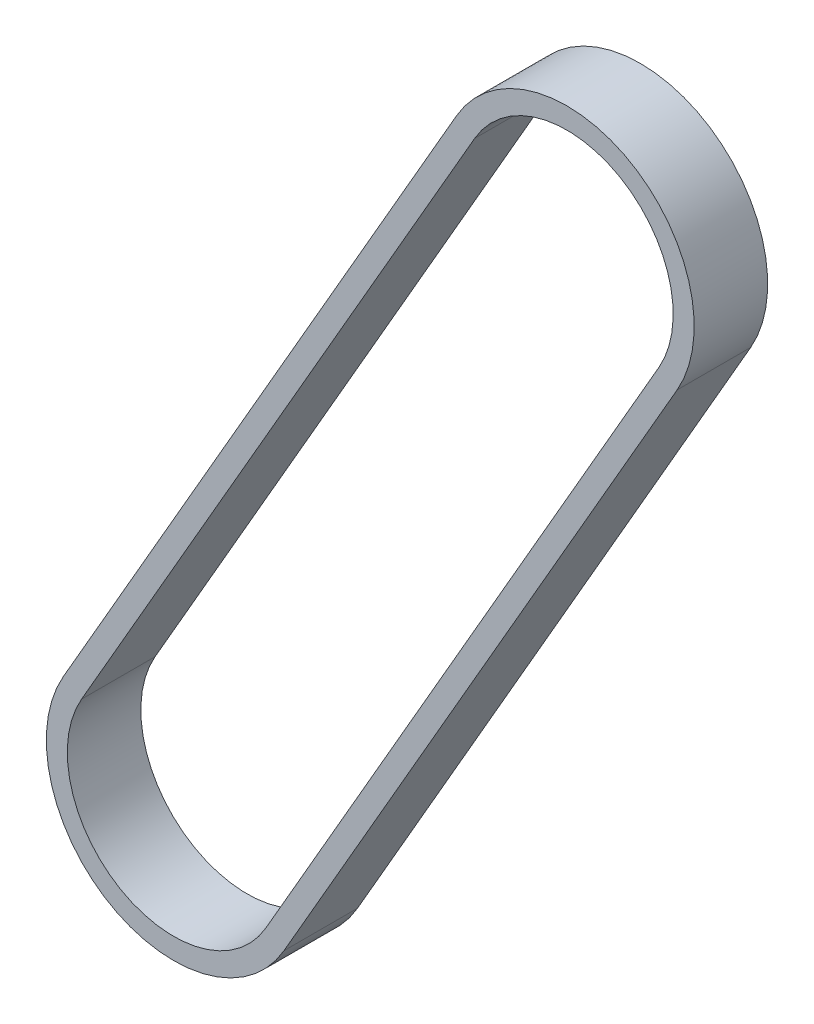
ISO-10303-21;
HEADER;
FILE_DESCRIPTION(('STEP AP214'),'2;1');
FILE_NAME('part.step','',(''),(''),'','','');
FILE_SCHEMA(('AUTOMOTIVE_DESIGN { 1 0 10303 214 1 1 1 1 }'));
ENDSEC;
DATA;
#1=APPLICATION_CONTEXT('core data for automotive mechanical design processes');
#2=APPLICATION_PROTOCOL_DEFINITION('international standard','automotive_design',2000,#1);
#3=PRODUCT_CONTEXT('',#1,'mechanical');
#4=PRODUCT('Part','Part','',(#3));
#5=PRODUCT_RELATED_PRODUCT_CATEGORY('part','',(#4));
#6=PRODUCT_DEFINITION_FORMATION('','',#4);
#7=PRODUCT_DEFINITION_CONTEXT('part definition',#1,'design');
#8=PRODUCT_DEFINITION('design','',#6,#7);
#9=PRODUCT_DEFINITION_SHAPE('','',#8);
#10=(LENGTH_UNIT() NAMED_UNIT(*) SI_UNIT(.MILLI.,.METRE.));
#11=(NAMED_UNIT(*) PLANE_ANGLE_UNIT() SI_UNIT($,.RADIAN.));
#12=(NAMED_UNIT(*) SI_UNIT($,.STERADIAN.) SOLID_ANGLE_UNIT());
#13=UNCERTAINTY_MEASURE_WITH_UNIT(LENGTH_MEASURE(1.E-05),#10,'distance_accuracy_value','');
#14=(GEOMETRIC_REPRESENTATION_CONTEXT(3) GLOBAL_UNCERTAINTY_ASSIGNED_CONTEXT((#13)) GLOBAL_UNIT_ASSIGNED_CONTEXT((#10,
#11,#12)) REPRESENTATION_CONTEXT('',''));
#15=CARTESIAN_POINT('',(0.,0.,0.));
#16=DIRECTION('',(0.,0.,1.));
#17=DIRECTION('',(1.,0.,0.));
#18=AXIS2_PLACEMENT_3D('',#15,#16,#17);
#19=CARTESIAN_POINT('',(-27.0067414246904,31.998578186546,3.5));
#20=DIRECTION('',(0.,0.,-1.));
#21=DIRECTION('',(-1.,0.,0.));
#22=AXIS2_PLACEMENT_3D('',#19,#20,#21);
#23=PLANE('',#22);
#24=CARTESIAN_POINT('',(-27.0067414246904,31.998578186546,3.5));
#25=DIRECTION('',(0.,0.,-1.));
#26=DIRECTION('',(-1.,0.,0.));
#27=AXIS2_PLACEMENT_3D('',#24,#25,#26);
#28=CIRCLE('',#27,12.125);
#29=CARTESIAN_POINT('',(-16.5014356972318,25.9443089017663,3.5));
#30=VERTEX_POINT('',#29);
#31=CARTESIAN_POINT('',(-37.5120471521489,38.0528474713257,3.5));
#32=VERTEX_POINT('',#31);
#33=EDGE_CURVE('E160',#30,#32,#28,.F.);
#34=ORIENTED_EDGE('',*,*,#33,.T.);
#35=DIRECTION('',(-0.499321178126161,-0.866416967213075,0.));
#36=VECTOR('',#35,1.);
#37=CARTESIAN_POINT('',(-37.5120471521489,38.0528474713257,3.5));
#38=LINE('',#37,#36);
#39=CARTESIAN_POINT('',(-74.961135511611,-26.928425069655,3.5));
#40=VERTEX_POINT('',#39);
#41=EDGE_CURVE('E163',#32,#40,#38,.T.);
#42=ORIENTED_EDGE('',*,*,#41,.T.);
#43=CARTESIAN_POINT('',(-64.4558297841525,-32.9826943544347,3.5));
#44=DIRECTION('',(0.,0.,-1.));
#45=DIRECTION('',(-1.,0.,0.));
#46=AXIS2_PLACEMENT_3D('',#43,#44,#45);
#47=CIRCLE('',#46,12.125);
#48=CARTESIAN_POINT('',(-53.9505240566939,-39.0369636392144,3.5));
#49=VERTEX_POINT('',#48);
#50=EDGE_CURVE('E166',#40,#49,#47,.F.);
#51=ORIENTED_EDGE('',*,*,#50,.T.);
#52=DIRECTION('',(0.499321178126161,0.866416967213075,0.));
#53=VECTOR('',#52,1.);
#54=CARTESIAN_POINT('',(-16.5014356972318,25.9443089017663,3.5));
#55=LINE('',#54,#53);
#56=EDGE_CURVE('E168',#49,#30,#55,.T.);
#57=ORIENTED_EDGE('',*,*,#56,.T.);
#58=EDGE_LOOP('',(#34,#42,#51,#57));
#59=FACE_BOUND('',#58,.T.);
#60=CARTESIAN_POINT('',(-27.0067414246904,31.998578186546,3.5));
#61=DIRECTION('',(0.,0.,1.));
#62=DIRECTION('',(-1.,0.,0.));
#63=AXIS2_PLACEMENT_3D('',#60,#61,#62);
#64=CIRCLE('',#63,10.125);
#65=CARTESIAN_POINT('',(-18.234269631658,26.9429512580186,3.5));
#66=VERTEX_POINT('',#65);
#67=CARTESIAN_POINT('',(-35.7792132177228,37.0542051150734,3.5));
#68=VERTEX_POINT('',#67);
#69=EDGE_CURVE('E124',#66,#68,#64,.T.);
#70=ORIENTED_EDGE('',*,*,#69,.F.);
#71=DIRECTION('',(0.499321178126161,0.866416967213075,0.));
#72=VECTOR('',#71,1.);
#73=CARTESIAN_POINT('',(-18.234269631658,26.9429512580186,3.5));
#74=LINE('',#73,#72);
#75=CARTESIAN_POINT('',(-55.6833579911201,-38.038321282962,3.5));
#76=VERTEX_POINT('',#75);
#77=EDGE_CURVE('E146',#76,#66,#74,.T.);
#78=ORIENTED_EDGE('',*,*,#77,.F.);
#79=CARTESIAN_POINT('',(-64.4558297841525,-32.9826943544347,3.5));
#80=DIRECTION('',(0.,0.,1.));
#81=DIRECTION('',(-1.,0.,0.));
#82=AXIS2_PLACEMENT_3D('',#79,#80,#81);
#83=CIRCLE('',#82,10.125);
#84=CARTESIAN_POINT('',(-73.2283015771848,-27.9270674259073,3.5));
#85=VERTEX_POINT('',#84);
#86=EDGE_CURVE('E144',#85,#76,#83,.T.);
#87=ORIENTED_EDGE('',*,*,#86,.F.);
#88=DIRECTION('',(-0.499321178126161,-0.866416967213075,0.));
#89=VECTOR('',#88,1.);
#90=CARTESIAN_POINT('',(-73.2283015771848,-27.9270674259073,3.5));
#91=LINE('',#90,#89);
#92=EDGE_CURVE('E132',#68,#85,#91,.T.);
#93=ORIENTED_EDGE('',*,*,#92,.F.);
#94=EDGE_LOOP('',(#70,#78,#87,#93));
#95=FACE_BOUND('',#94,.T.);
#96=ADVANCED_FACE('F59',(#59,#95),#23,.F.);
#97=CARTESIAN_POINT('',(-27.0067414246904,31.998578186546,-3.5));
#98=DIRECTION('',(0.,0.,-1.));
#99=DIRECTION('',(-1.,0.,0.));
#100=AXIS2_PLACEMENT_3D('',#97,#98,#99);
#101=PLANE('',#100);
#102=CARTESIAN_POINT('',(-27.0067414246904,31.998578186546,-3.5));
#103=DIRECTION('',(0.,0.,-1.));
#104=DIRECTION('',(-1.,0.,0.));
#105=AXIS2_PLACEMENT_3D('',#102,#103,#104);
#106=CIRCLE('',#105,12.125);
#107=CARTESIAN_POINT('',(-16.5014356972318,25.9443089017663,-3.5));
#108=VERTEX_POINT('',#107);
#109=CARTESIAN_POINT('',(-37.5120471521489,38.0528474713257,-3.5));
#110=VERTEX_POINT('',#109);
#111=EDGE_CURVE('E140',#108,#110,#106,.F.);
#112=ORIENTED_EDGE('',*,*,#111,.F.);
#113=DIRECTION('',(0.499321178126161,0.866416967213075,0.));
#114=VECTOR('',#113,1.);
#115=CARTESIAN_POINT('',(-16.5014356972318,25.9443089017663,-3.5));
#116=LINE('',#115,#114);
#117=CARTESIAN_POINT('',(-53.9505240566939,-39.0369636392144,-3.5));
#118=VERTEX_POINT('',#117);
#119=EDGE_CURVE('E164',#118,#108,#116,.T.);
#120=ORIENTED_EDGE('',*,*,#119,.F.);
#121=CARTESIAN_POINT('',(-64.4558297841525,-32.9826943544347,-3.5));
#122=DIRECTION('',(0.,0.,-1.));
#123=DIRECTION('',(-1.,0.,0.));
#124=AXIS2_PLACEMENT_3D('',#121,#122,#123);
#125=CIRCLE('',#124,12.125);
#126=CARTESIAN_POINT('',(-74.961135511611,-26.928425069655,-3.5));
#127=VERTEX_POINT('',#126);
#128=EDGE_CURVE('E175',#127,#118,#125,.F.);
#129=ORIENTED_EDGE('',*,*,#128,.F.);
#130=DIRECTION('',(-0.499321178126161,-0.866416967213075,0.));
#131=VECTOR('',#130,1.);
#132=CARTESIAN_POINT('',(-37.5120471521489,38.0528474713257,-3.5));
#133=LINE('',#132,#131);
#134=EDGE_CURVE('E173',#110,#127,#133,.T.);
#135=ORIENTED_EDGE('',*,*,#134,.F.);
#136=EDGE_LOOP('',(#112,#120,#129,#135));
#137=FACE_BOUND('',#136,.T.);
#138=DIRECTION('',(0.499321178126161,0.866416967213075,0.));
#139=VECTOR('',#138,1.);
#140=CARTESIAN_POINT('',(-18.234269631658,26.9429512580186,-3.5));
#141=LINE('',#140,#139);
#142=CARTESIAN_POINT('',(-55.6833579911201,-38.038321282962,-3.5));
#143=VERTEX_POINT('',#142);
#144=CARTESIAN_POINT('',(-18.234269631658,26.9429512580186,-3.5));
#145=VERTEX_POINT('',#144);
#146=EDGE_CURVE('E133',#143,#145,#141,.T.);
#147=ORIENTED_EDGE('',*,*,#146,.T.);
#148=CARTESIAN_POINT('',(-27.0067414246904,31.998578186546,-3.5));
#149=DIRECTION('',(0.,0.,1.));
#150=DIRECTION('',(-1.,0.,0.));
#151=AXIS2_PLACEMENT_3D('',#148,#149,#150);
#152=CIRCLE('',#151,10.125);
#153=CARTESIAN_POINT('',(-35.7792132177228,37.0542051150734,-3.5));
#154=VERTEX_POINT('',#153);
#155=EDGE_CURVE('E82',#145,#154,#152,.T.);
#156=ORIENTED_EDGE('',*,*,#155,.T.);
#157=DIRECTION('',(-0.499321178126161,-0.866416967213075,0.));
#158=VECTOR('',#157,1.);
#159=CARTESIAN_POINT('',(-73.2283015771848,-27.9270674259073,-3.5));
#160=LINE('',#159,#158);
#161=CARTESIAN_POINT('',(-73.2283015771848,-27.9270674259073,-3.5));
#162=VERTEX_POINT('',#161);
#163=EDGE_CURVE('E139',#154,#162,#160,.T.);
#164=ORIENTED_EDGE('',*,*,#163,.T.);
#165=CARTESIAN_POINT('',(-64.4558297841525,-32.9826943544347,-3.5));
#166=DIRECTION('',(0.,0.,1.));
#167=DIRECTION('',(-1.,0.,0.));
#168=AXIS2_PLACEMENT_3D('',#165,#166,#167);
#169=CIRCLE('',#168,10.125);
#170=EDGE_CURVE('E152',#162,#143,#169,.T.);
#171=ORIENTED_EDGE('',*,*,#170,.T.);
#172=EDGE_LOOP('',(#147,#156,#164,#171));
#173=FACE_BOUND('',#172,.T.);
#174=ADVANCED_FACE('F193',(#137,#173),#101,.T.);
#175=CARTESIAN_POINT('',(-27.0067414246904,31.998578186546,3.5));
#176=DIRECTION('',(0.,0.,-1.));
#177=DIRECTION('',(-1.,0.,0.));
#178=AXIS2_PLACEMENT_3D('',#175,#176,#177);
#179=CYLINDRICAL_SURFACE('',#178,12.125);
#180=ORIENTED_EDGE('',*,*,#111,.T.);
#181=DIRECTION('',(0.,0.,-1.));
#182=VECTOR('',#181,1.);
#183=CARTESIAN_POINT('',(-37.5120471521489,38.0528474713257,3.5));
#184=LINE('',#183,#182);
#185=EDGE_CURVE('E12',#32,#110,#184,.T.);
#186=ORIENTED_EDGE('',*,*,#185,.F.);
#187=ORIENTED_EDGE('',*,*,#33,.F.);
#188=DIRECTION('',(0.,0.,-1.));
#189=VECTOR('',#188,1.);
#190=CARTESIAN_POINT('',(-16.5014356972318,25.9443089017663,3.5));
#191=LINE('',#190,#189);
#192=EDGE_CURVE('E170',#30,#108,#191,.T.);
#193=ORIENTED_EDGE('',*,*,#192,.T.);
#194=EDGE_LOOP('',(#180,#186,#187,#193));
#195=FACE_BOUND('',#194,.T.);
#196=ADVANCED_FACE('F61',(#195),#179,.T.);
#197=CARTESIAN_POINT('',(-37.5120471521489,38.0528474713257,3.5));
#198=DIRECTION('',(0.866416967213075,-0.499321178126161,0.));
#199=DIRECTION('',(0.499321178126161,0.866416967213075,0.));
#200=AXIS2_PLACEMENT_3D('',#197,#198,#199);
#201=PLANE('',#200);
#202=ORIENTED_EDGE('',*,*,#134,.T.);
#203=DIRECTION('',(0.,0.,-1.));
#204=VECTOR('',#203,1.);
#205=CARTESIAN_POINT('',(-74.961135511611,-26.928425069655,3.5));
#206=LINE('',#205,#204);
#207=EDGE_CURVE('E67',#40,#127,#206,.T.);
#208=ORIENTED_EDGE('',*,*,#207,.F.);
#209=ORIENTED_EDGE('',*,*,#41,.F.);
#210=ORIENTED_EDGE('',*,*,#185,.T.);
#211=EDGE_LOOP('',(#202,#208,#209,#210));
#212=FACE_BOUND('',#211,.T.);
#213=ADVANCED_FACE('F203',(#212),#201,.F.);
#214=CARTESIAN_POINT('',(-64.4558297841525,-32.9826943544347,3.5));
#215=DIRECTION('',(0.,0.,-1.));
#216=DIRECTION('',(-1.,0.,0.));
#217=AXIS2_PLACEMENT_3D('',#214,#215,#216);
#218=CYLINDRICAL_SURFACE('',#217,12.125);
#219=ORIENTED_EDGE('',*,*,#128,.T.);
#220=DIRECTION('',(0.,0.,-1.));
#221=VECTOR('',#220,1.);
#222=CARTESIAN_POINT('',(-53.9505240566939,-39.0369636392144,3.5));
#223=LINE('',#222,#221);
#224=EDGE_CURVE('E180',#49,#118,#223,.T.);
#225=ORIENTED_EDGE('',*,*,#224,.F.);
#226=ORIENTED_EDGE('',*,*,#50,.F.);
#227=ORIENTED_EDGE('',*,*,#207,.T.);
#228=EDGE_LOOP('',(#219,#225,#226,#227));
#229=FACE_BOUND('',#228,.T.);
#230=ADVANCED_FACE('F187',(#229),#218,.T.);
#231=CARTESIAN_POINT('',(-16.5014356972318,25.9443089017663,3.5));
#232=DIRECTION('',(-0.866416967213075,0.499321178126161,0.));
#233=DIRECTION('',(-0.499321178126161,-0.866416967213075,0.));
#234=AXIS2_PLACEMENT_3D('',#231,#232,#233);
#235=PLANE('',#234);
#236=ORIENTED_EDGE('',*,*,#119,.T.);
#237=ORIENTED_EDGE('',*,*,#192,.F.);
#238=ORIENTED_EDGE('',*,*,#56,.F.);
#239=ORIENTED_EDGE('',*,*,#224,.T.);
#240=EDGE_LOOP('',(#236,#237,#238,#239));
#241=FACE_BOUND('',#240,.T.);
#242=ADVANCED_FACE('F197',(#241),#235,.F.);
#243=CARTESIAN_POINT('',(-27.0067414246904,31.998578186546,3.5));
#244=DIRECTION('',(0.,0.,-1.));
#245=DIRECTION('',(-1.,0.,0.));
#246=AXIS2_PLACEMENT_3D('',#243,#244,#245);
#247=CYLINDRICAL_SURFACE('',#246,10.125);
#248=ORIENTED_EDGE('',*,*,#155,.F.);
#249=DIRECTION('',(0.,0.,-1.));
#250=VECTOR('',#249,1.);
#251=CARTESIAN_POINT('',(-18.234269631658,26.9429512580186,3.5));
#252=LINE('',#251,#250);
#253=EDGE_CURVE('E128',#66,#145,#252,.T.);
#254=ORIENTED_EDGE('',*,*,#253,.F.);
#255=ORIENTED_EDGE('',*,*,#69,.T.);
#256=DIRECTION('',(0.,0.,-1.));
#257=VECTOR('',#256,1.);
#258=CARTESIAN_POINT('',(-35.7792132177228,37.0542051150734,3.5));
#259=LINE('',#258,#257);
#260=EDGE_CURVE('E127',#68,#154,#259,.T.);
#261=ORIENTED_EDGE('',*,*,#260,.T.);
#262=EDGE_LOOP('',(#248,#254,#255,#261));
#263=FACE_BOUND('',#262,.T.);
#264=ADVANCED_FACE('F126',(#263),#247,.F.);
#265=CARTESIAN_POINT('',(-73.2283015771848,-27.9270674259073,3.5));
#266=DIRECTION('',(0.866416967213075,-0.499321178126161,0.));
#267=DIRECTION('',(0.499321178126161,0.866416967213075,0.));
#268=AXIS2_PLACEMENT_3D('',#265,#266,#267);
#269=PLANE('',#268);
#270=ORIENTED_EDGE('',*,*,#163,.F.);
#271=ORIENTED_EDGE('',*,*,#260,.F.);
#272=ORIENTED_EDGE('',*,*,#92,.T.);
#273=DIRECTION('',(0.,0.,-1.));
#274=VECTOR('',#273,1.);
#275=CARTESIAN_POINT('',(-73.2283015771848,-27.9270674259073,3.5));
#276=LINE('',#275,#274);
#277=EDGE_CURVE('E141',#85,#162,#276,.T.);
#278=ORIENTED_EDGE('',*,*,#277,.T.);
#279=EDGE_LOOP('',(#270,#271,#272,#278));
#280=FACE_BOUND('',#279,.T.);
#281=ADVANCED_FACE('F136',(#280),#269,.T.);
#282=CARTESIAN_POINT('',(-64.4558297841525,-32.9826943544347,3.5));
#283=DIRECTION('',(0.,0.,-1.));
#284=DIRECTION('',(-1.,0.,0.));
#285=AXIS2_PLACEMENT_3D('',#282,#283,#284);
#286=CYLINDRICAL_SURFACE('',#285,10.125);
#287=ORIENTED_EDGE('',*,*,#170,.F.);
#288=ORIENTED_EDGE('',*,*,#277,.F.);
#289=ORIENTED_EDGE('',*,*,#86,.T.);
#290=DIRECTION('',(0.,0.,-1.));
#291=VECTOR('',#290,1.);
#292=CARTESIAN_POINT('',(-55.6833579911201,-38.038321282962,3.5));
#293=LINE('',#292,#291);
#294=EDGE_CURVE('E74',#76,#143,#293,.T.);
#295=ORIENTED_EDGE('',*,*,#294,.T.);
#296=EDGE_LOOP('',(#287,#288,#289,#295));
#297=FACE_BOUND('',#296,.T.);
#298=ADVANCED_FACE('F226',(#297),#286,.F.);
#299=CARTESIAN_POINT('',(-18.234269631658,26.9429512580186,3.5));
#300=DIRECTION('',(-0.866416967213075,0.499321178126161,0.));
#301=DIRECTION('',(-0.499321178126161,-0.866416967213075,0.));
#302=AXIS2_PLACEMENT_3D('',#299,#300,#301);
#303=PLANE('',#302);
#304=ORIENTED_EDGE('',*,*,#146,.F.);
#305=ORIENTED_EDGE('',*,*,#294,.F.);
#306=ORIENTED_EDGE('',*,*,#77,.T.);
#307=ORIENTED_EDGE('',*,*,#253,.T.);
#308=EDGE_LOOP('',(#304,#305,#306,#307));
#309=FACE_BOUND('',#308,.T.);
#310=ADVANCED_FACE('F230',(#309),#303,.T.);
#311=CLOSED_SHELL('',(#96,#174,#196,#213,#230,#242,#264,#281,#298,#310));
#312=MANIFOLD_SOLID_BREP('B2',#311);
#313=ADVANCED_BREP_SHAPE_REPRESENTATION('',(#18,#312),#14);
#314=SHAPE_DEFINITION_REPRESENTATION(#9,#313);
ENDSEC;
END-ISO-10303-21;
